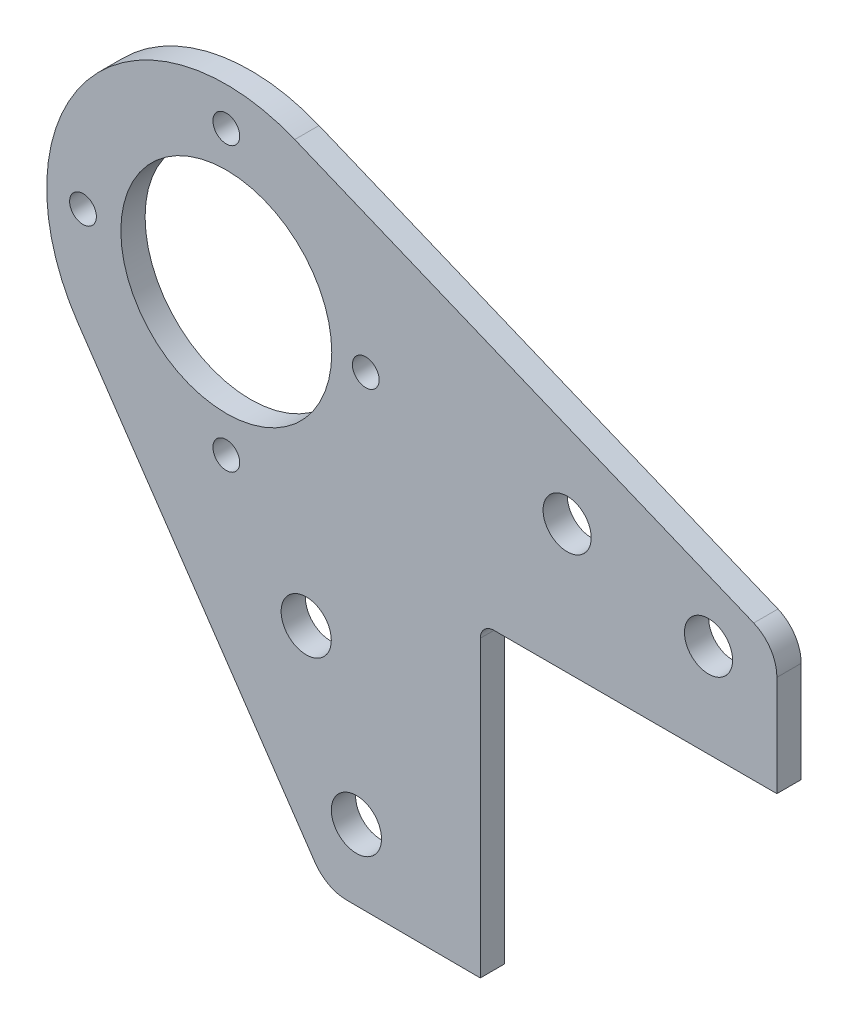
ISO-10303-21;
HEADER;
FILE_DESCRIPTION(('STEP AP214'),'2;1');
FILE_NAME('part.step','',(''),(''),'','','');
FILE_SCHEMA(('AUTOMOTIVE_DESIGN { 1 0 10303 214 1 1 1 1 }'));
ENDSEC;
DATA;
#1=APPLICATION_CONTEXT('core data for automotive mechanical design processes');
#2=APPLICATION_PROTOCOL_DEFINITION('international standard','automotive_design',2000,#1);
#3=PRODUCT_CONTEXT('',#1,'mechanical');
#4=PRODUCT('Part','Part','',(#3));
#5=PRODUCT_RELATED_PRODUCT_CATEGORY('part','',(#4));
#6=PRODUCT_DEFINITION_FORMATION('','',#4);
#7=PRODUCT_DEFINITION_CONTEXT('part definition',#1,'design');
#8=PRODUCT_DEFINITION('design','',#6,#7);
#9=PRODUCT_DEFINITION_SHAPE('','',#8);
#10=(LENGTH_UNIT() NAMED_UNIT(*) SI_UNIT(.MILLI.,.METRE.));
#11=(NAMED_UNIT(*) PLANE_ANGLE_UNIT() SI_UNIT($,.RADIAN.));
#12=(NAMED_UNIT(*) SI_UNIT($,.STERADIAN.) SOLID_ANGLE_UNIT());
#13=UNCERTAINTY_MEASURE_WITH_UNIT(LENGTH_MEASURE(1.E-05),#10,'distance_accuracy_value','');
#14=(GEOMETRIC_REPRESENTATION_CONTEXT(3) GLOBAL_UNCERTAINTY_ASSIGNED_CONTEXT((#13)) GLOBAL_UNIT_ASSIGNED_CONTEXT((#10,
#11,#12)) REPRESENTATION_CONTEXT('',''));
#15=CARTESIAN_POINT('',(0.,0.,0.));
#16=DIRECTION('',(0.,0.,1.));
#17=DIRECTION('',(1.,0.,0.));
#18=AXIS2_PLACEMENT_3D('',#15,#16,#17);
#19=CARTESIAN_POINT('',(38.9957298317535,5.45191666327589,-3.175));
#20=DIRECTION('',(0.,0.,1.));
#21=DIRECTION('',(1.,0.,0.));
#22=AXIS2_PLACEMENT_3D('',#19,#20,#21);
#23=CYLINDRICAL_SURFACE('',#22,4.99999999999999);
#24=CARTESIAN_POINT('',(38.9957298317535,5.45191666327589,0.));
#25=DIRECTION('',(0.,0.,1.));
#26=DIRECTION('',(1.,0.,0.));
#27=AXIS2_PLACEMENT_3D('',#24,#25,#26);
#28=CIRCLE('',#27,4.99999999999999);
#29=CARTESIAN_POINT('',(34.8610962891506,2.64036807426255,0.));
#30=VERTEX_POINT('',#29);
#31=CARTESIAN_POINT('',(38.970667363926,0.451979476399808,0.));
#32=VERTEX_POINT('',#31);
#33=EDGE_CURVE('E152',#30,#32,#28,.T.);
#34=ORIENTED_EDGE('',*,*,#33,.F.);
#35=DIRECTION('',(0.,0.,1.));
#36=VECTOR('',#35,1.);
#37=CARTESIAN_POINT('',(34.8610962891506,2.64036807426255,-3.175));
#38=LINE('',#37,#36);
#39=CARTESIAN_POINT('',(34.8610962891506,2.64036807426255,-3.175));
#40=VERTEX_POINT('',#39);
#41=EDGE_CURVE('E11',#40,#30,#38,.T.);
#42=ORIENTED_EDGE('',*,*,#41,.F.);
#43=CARTESIAN_POINT('',(38.9957298317535,5.45191666327589,-3.175));
#44=DIRECTION('',(0.,0.,1.));
#45=DIRECTION('',(1.,0.,0.));
#46=AXIS2_PLACEMENT_3D('',#43,#44,#45);
#47=CIRCLE('',#46,4.99999999999999);
#48=CARTESIAN_POINT('',(38.970667363926,0.451979476399808,-3.175));
#49=VERTEX_POINT('',#48);
#50=EDGE_CURVE('E179',#40,#49,#47,.T.);
#51=ORIENTED_EDGE('',*,*,#50,.T.);
#52=DIRECTION('',(0.,0.,1.));
#53=VECTOR('',#52,1.);
#54=CARTESIAN_POINT('',(38.970667363926,0.451979476399808,-3.175));
#55=LINE('',#54,#53);
#56=EDGE_CURVE('E46',#49,#32,#55,.T.);
#57=ORIENTED_EDGE('',*,*,#56,.T.);
#58=EDGE_LOOP('',(#34,#42,#51,#57));
#59=FACE_BOUND('',#58,.T.);
#60=ADVANCED_FACE('F43',(#59),#23,.T.);
#61=CARTESIAN_POINT('',(3.8138082519263,48.2981806502894,-3.175));
#62=DIRECTION('',(-0.826926708520586,-0.562309717802662,0.));
#63=DIRECTION('',(0.562309717802662,-0.826926708520586,0.));
#64=AXIS2_PLACEMENT_3D('',#61,#62,#63);
#65=PLANE('',#64);
#66=DIRECTION('',(0.562309717802662,-0.826926708520586,0.));
#67=VECTOR('',#66,1.);
#68=CARTESIAN_POINT('',(3.8138082519263,48.2981806502894,0.));
#69=LINE('',#68,#67);
#70=CARTESIAN_POINT('',(3.8138082519263,48.2981806502894,0.));
#71=VERTEX_POINT('',#70);
#72=EDGE_CURVE('E177',#71,#30,#69,.T.);
#73=ORIENTED_EDGE('',*,*,#72,.F.);
#74=DIRECTION('',(0.,0.,1.));
#75=VECTOR('',#74,1.);
#76=CARTESIAN_POINT('',(3.8138082519263,48.2981806502894,-3.175));
#77=LINE('',#76,#75);
#78=CARTESIAN_POINT('',(3.8138082519263,48.2981806502894,-3.175));
#79=VERTEX_POINT('',#78);
#80=EDGE_CURVE('E52',#79,#71,#77,.T.);
#81=ORIENTED_EDGE('',*,*,#80,.F.);
#82=DIRECTION('',(0.562309717802662,-0.826926708520586,0.));
#83=VECTOR('',#82,1.);
#84=CARTESIAN_POINT('',(3.8138082519263,48.2981806502894,-3.175));
#85=LINE('',#84,#83);
#86=EDGE_CURVE('E142',#79,#40,#85,.T.);
#87=ORIENTED_EDGE('',*,*,#86,.T.);
#88=ORIENTED_EDGE('',*,*,#41,.T.);
#89=EDGE_LOOP('',(#73,#81,#87,#88));
#90=FACE_BOUND('',#89,.T.);
#91=ADVANCED_FACE('F195',(#90),#65,.T.);
#92=CARTESIAN_POINT('',(23.2465826059849,61.5124567772546,-3.175));
#93=DIRECTION('',(0.,0.,1.));
#94=DIRECTION('',(1.,0.,0.));
#95=AXIS2_PLACEMENT_3D('',#92,#93,#94);
#96=CYLINDRICAL_SURFACE('',#95,23.4999960139452);
#97=CARTESIAN_POINT('',(23.2465826059849,61.5124567772546,0.));
#98=DIRECTION('',(0.,0.,1.));
#99=DIRECTION('',(1.,0.,0.));
#100=AXIS2_PLACEMENT_3D('',#97,#98,#99);
#101=CIRCLE('',#100,23.4999960139452);
#102=CARTESIAN_POINT('',(32.2026397845729,83.2389119061821,0.));
#103=VERTEX_POINT('',#102);
#104=EDGE_CURVE('E129',#103,#71,#101,.T.);
#105=ORIENTED_EDGE('',*,*,#104,.F.);
#106=DIRECTION('',(0.,0.,1.));
#107=VECTOR('',#106,1.);
#108=CARTESIAN_POINT('',(32.2026397845729,83.2389119061821,-3.175));
#109=LINE('',#108,#107);
#110=CARTESIAN_POINT('',(32.2026397845729,83.2389119061821,-3.175));
#111=VERTEX_POINT('',#110);
#112=EDGE_CURVE('E124',#111,#103,#109,.T.);
#113=ORIENTED_EDGE('',*,*,#112,.F.);
#114=CARTESIAN_POINT('',(23.2465826059849,61.5124567772546,-3.175));
#115=DIRECTION('',(0.,0.,1.));
#116=DIRECTION('',(1.,0.,0.));
#117=AXIS2_PLACEMENT_3D('',#114,#115,#116);
#118=CIRCLE('',#117,23.4999960139452);
#119=EDGE_CURVE('E127',#111,#79,#118,.T.);
#120=ORIENTED_EDGE('',*,*,#119,.T.);
#121=ORIENTED_EDGE('',*,*,#80,.T.);
#122=EDGE_LOOP('',(#105,#113,#120,#121));
#123=FACE_BOUND('',#122,.T.);
#124=ADVANCED_FACE('F126',(#123),#96,.T.);
#125=CARTESIAN_POINT('',(92.2574763707311,58.4831684070844,-3.175));
#126=DIRECTION('',(0.381108880753566,0.924530162304488,0.));
#127=DIRECTION('',(-0.924530162304489,0.381108880753567,0.));
#128=AXIS2_PLACEMENT_3D('',#125,#126,#127);
#129=PLANE('',#128);
#130=DIRECTION('',(-0.924530162304488,0.381108880753566,0.));
#131=VECTOR('',#130,1.);
#132=CARTESIAN_POINT('',(92.2574763707311,58.4831684070844,0.));
#133=LINE('',#132,#131);
#134=CARTESIAN_POINT('',(92.2574763707311,58.4831684070844,0.));
#135=VERTEX_POINT('',#134);
#136=EDGE_CURVE('E174',#135,#103,#133,.T.);
#137=ORIENTED_EDGE('',*,*,#136,.F.);
#138=DIRECTION('',(0.,0.,1.));
#139=VECTOR('',#138,1.);
#140=CARTESIAN_POINT('',(92.2574763707311,58.4831684070844,-3.175));
#141=LINE('',#140,#139);
#142=CARTESIAN_POINT('',(92.2574763707311,58.4831684070844,-3.175));
#143=VERTEX_POINT('',#142);
#144=EDGE_CURVE('E134',#143,#135,#141,.T.);
#145=ORIENTED_EDGE('',*,*,#144,.F.);
#146=DIRECTION('',(-0.924530162304488,0.381108880753566,0.));
#147=VECTOR('',#146,1.);
#148=CARTESIAN_POINT('',(92.2574763707311,58.4831684070844,-3.175));
#149=LINE('',#148,#147);
#150=EDGE_CURVE('E140',#143,#111,#149,.T.);
#151=ORIENTED_EDGE('',*,*,#150,.T.);
#152=ORIENTED_EDGE('',*,*,#112,.T.);
#153=EDGE_LOOP('',(#137,#145,#151,#152));
#154=FACE_BOUND('',#153,.T.);
#155=ADVANCED_FACE('F144',(#154),#129,.T.);
#156=CARTESIAN_POINT('',(90.2860810938705,53.8882145811605,-3.175));
#157=DIRECTION('',(0.,0.,1.));
#158=DIRECTION('',(1.,0.,0.));
#159=AXIS2_PLACEMENT_3D('',#156,#157,#158);
#160=CYLINDRICAL_SURFACE('',#159,5.00000000000008);
#161=CARTESIAN_POINT('',(90.2860810938705,53.8882145811605,0.));
#162=DIRECTION('',(0.,0.,1.));
#163=DIRECTION('',(1.,0.,0.));
#164=AXIS2_PLACEMENT_3D('',#161,#162,#163);
#165=CIRCLE('',#164,5.00000000000008);
#166=CARTESIAN_POINT('',(95.2858044746185,53.8356207031641,0.));
#167=VERTEX_POINT('',#166);
#168=EDGE_CURVE('E171',#167,#135,#165,.T.);
#169=ORIENTED_EDGE('',*,*,#168,.F.);
#170=DIRECTION('',(0.,0.,1.));
#171=VECTOR('',#170,1.);
#172=CARTESIAN_POINT('',(95.2858044746185,53.8356207031641,-3.175));
#173=LINE('',#172,#171);
#174=CARTESIAN_POINT('',(95.2858044746185,53.8356207031641,-3.175));
#175=VERTEX_POINT('',#174);
#176=EDGE_CURVE('E183',#175,#167,#173,.T.);
#177=ORIENTED_EDGE('',*,*,#176,.F.);
#178=CARTESIAN_POINT('',(90.2860810938705,53.8882145811605,-3.175));
#179=DIRECTION('',(0.,0.,1.));
#180=DIRECTION('',(1.,0.,0.));
#181=AXIS2_PLACEMENT_3D('',#178,#179,#180);
#182=CIRCLE('',#181,5.00000000000008);
#183=EDGE_CURVE('E145',#175,#143,#182,.T.);
#184=ORIENTED_EDGE('',*,*,#183,.T.);
#185=ORIENTED_EDGE('',*,*,#144,.T.);
#186=EDGE_LOOP('',(#169,#177,#184,#185));
#187=FACE_BOUND('',#186,.T.);
#188=ADVANCED_FACE('F208',(#187),#160,.T.);
#189=CARTESIAN_POINT('',(95.2858044746185,40.6556179046592,-3.175));
#190=DIRECTION('',(1.,0.,0.));
#191=DIRECTION('',(0.,0.,-1.));
#192=AXIS2_PLACEMENT_3D('',#189,#190,#191);
#193=PLANE('',#192);
#194=DIRECTION('',(0.,1.,0.));
#195=VECTOR('',#194,1.);
#196=CARTESIAN_POINT('',(95.2858044746185,40.6556179046592,0.));
#197=LINE('',#196,#195);
#198=CARTESIAN_POINT('',(95.2858044746185,40.6556179046592,0.));
#199=VERTEX_POINT('',#198);
#200=EDGE_CURVE('E168',#199,#167,#197,.T.);
#201=ORIENTED_EDGE('',*,*,#200,.F.);
#202=DIRECTION('',(0.,0.,1.));
#203=VECTOR('',#202,1.);
#204=CARTESIAN_POINT('',(95.2858044746185,40.6556179046592,-3.175));
#205=LINE('',#204,#203);
#206=CARTESIAN_POINT('',(95.2858044746185,40.6556179046592,-3.175));
#207=VERTEX_POINT('',#206);
#208=EDGE_CURVE('E185',#207,#199,#205,.T.);
#209=ORIENTED_EDGE('',*,*,#208,.F.);
#210=DIRECTION('',(0.,1.,0.));
#211=VECTOR('',#210,1.);
#212=CARTESIAN_POINT('',(95.2858044746185,40.6556179046592,-3.175));
#213=LINE('',#212,#211);
#214=EDGE_CURVE('E147',#207,#175,#213,.T.);
#215=ORIENTED_EDGE('',*,*,#214,.T.);
#216=ORIENTED_EDGE('',*,*,#176,.T.);
#217=EDGE_LOOP('',(#201,#209,#215,#216));
#218=FACE_BOUND('',#217,.T.);
#219=ADVANCED_FACE('F211',(#218),#193,.T.);
#220=CARTESIAN_POINT('',(58.2853392910616,40.6556179046592,-3.175));
#221=DIRECTION('',(0.,-1.,0.));
#222=DIRECTION('',(0.,0.,-1.));
#223=AXIS2_PLACEMENT_3D('',#220,#221,#222);
#224=PLANE('',#223);
#225=DIRECTION('',(1.,0.,0.));
#226=VECTOR('',#225,1.);
#227=CARTESIAN_POINT('',(58.2853392910616,40.6556179046592,0.));
#228=LINE('',#227,#226);
#229=CARTESIAN_POINT('',(58.2853392910616,40.6556179046592,0.));
#230=VERTEX_POINT('',#229);
#231=EDGE_CURVE('E165',#230,#199,#228,.T.);
#232=ORIENTED_EDGE('',*,*,#231,.F.);
#233=DIRECTION('',(0.,0.,1.));
#234=VECTOR('',#233,1.);
#235=CARTESIAN_POINT('',(58.2853392910616,40.6556179046592,-3.175));
#236=LINE('',#235,#234);
#237=CARTESIAN_POINT('',(58.2853392910616,40.6556179046592,-3.175));
#238=VERTEX_POINT('',#237);
#239=EDGE_CURVE('E187',#238,#230,#236,.T.);
#240=ORIENTED_EDGE('',*,*,#239,.F.);
#241=DIRECTION('',(1.,0.,0.));
#242=VECTOR('',#241,1.);
#243=CARTESIAN_POINT('',(58.2853392910616,40.6556179046592,-3.175));
#244=LINE('',#243,#242);
#245=EDGE_CURVE('E341',#238,#207,#244,.T.);
#246=ORIENTED_EDGE('',*,*,#245,.T.);
#247=ORIENTED_EDGE('',*,*,#208,.T.);
#248=EDGE_LOOP('',(#232,#240,#246,#247));
#249=FACE_BOUND('',#248,.T.);
#250=ADVANCED_FACE('F215',(#249),#224,.T.);
#251=CARTESIAN_POINT('',(58.2763168026436,38.8556405173835,-3.175));
#252=DIRECTION('',(0.,0.,1.));
#253=DIRECTION('',(1.,0.,0.));
#254=AXIS2_PLACEMENT_3D('',#251,#252,#253);
#255=CYLINDRICAL_SURFACE('',#254,1.80000000000027);
#256=CARTESIAN_POINT('',(58.2763168026436,38.8556405173835,0.));
#257=DIRECTION('',(0.,0.,-1.));
#258=DIRECTION('',(1.,0.,0.));
#259=AXIS2_PLACEMENT_3D('',#256,#257,#258);
#260=CIRCLE('',#259,1.80000000000027);
#261=CARTESIAN_POINT('',(56.476339415368,38.8646630058014,0.));
#262=VERTEX_POINT('',#261);
#263=EDGE_CURVE('E162',#262,#230,#260,.T.);
#264=ORIENTED_EDGE('',*,*,#263,.F.);
#265=DIRECTION('',(0.,0.,1.));
#266=VECTOR('',#265,1.);
#267=CARTESIAN_POINT('',(56.476339415368,38.8646630058014,-3.175));
#268=LINE('',#267,#266);
#269=CARTESIAN_POINT('',(56.476339415368,38.8646630058014,-3.175));
#270=VERTEX_POINT('',#269);
#271=EDGE_CURVE('E189',#270,#262,#268,.T.);
#272=ORIENTED_EDGE('',*,*,#271,.F.);
#273=CARTESIAN_POINT('',(58.2763168026436,38.8556405173835,-3.175));
#274=DIRECTION('',(0.,0.,-1.));
#275=DIRECTION('',(1.,0.,0.));
#276=AXIS2_PLACEMENT_3D('',#273,#274,#275);
#277=CIRCLE('',#276,1.80000000000027);
#278=EDGE_CURVE('E338',#270,#238,#277,.T.);
#279=ORIENTED_EDGE('',*,*,#278,.T.);
#280=ORIENTED_EDGE('',*,*,#239,.T.);
#281=EDGE_LOOP('',(#264,#272,#279,#280));
#282=FACE_BOUND('',#281,.T.);
#283=ADVANCED_FACE('F219',(#282),#255,.F.);
#284=CARTESIAN_POINT('',(56.476339415368,0.364231305534529,-3.175));
#285=DIRECTION('',(1.,0.,0.));
#286=DIRECTION('',(0.,0.,-1.));
#287=AXIS2_PLACEMENT_3D('',#284,#285,#286);
#288=PLANE('',#287);
#289=DIRECTION('',(0.,1.,0.));
#290=VECTOR('',#289,1.);
#291=CARTESIAN_POINT('',(56.476339415368,0.364231305534529,0.));
#292=LINE('',#291,#290);
#293=CARTESIAN_POINT('',(56.476339415368,0.364231305534529,0.));
#294=VERTEX_POINT('',#293);
#295=EDGE_CURVE('E159',#294,#262,#292,.T.);
#296=ORIENTED_EDGE('',*,*,#295,.F.);
#297=DIRECTION('',(0.,0.,1.));
#298=VECTOR('',#297,1.);
#299=CARTESIAN_POINT('',(56.476339415368,0.364231305534529,-3.175));
#300=LINE('',#299,#298);
#301=CARTESIAN_POINT('',(56.476339415368,0.364231305534529,-3.175));
#302=VERTEX_POINT('',#301);
#303=EDGE_CURVE('E190',#302,#294,#300,.T.);
#304=ORIENTED_EDGE('',*,*,#303,.F.);
#305=DIRECTION('',(0.,1.,0.));
#306=VECTOR('',#305,1.);
#307=CARTESIAN_POINT('',(56.476339415368,0.364231305534529,-3.175));
#308=LINE('',#307,#306);
#309=EDGE_CURVE('E335',#302,#270,#308,.T.);
#310=ORIENTED_EDGE('',*,*,#309,.T.);
#311=ORIENTED_EDGE('',*,*,#271,.T.);
#312=EDGE_LOOP('',(#296,#304,#310,#311));
#313=FACE_BOUND('',#312,.T.);
#314=ADVANCED_FACE('F223',(#313),#288,.T.);
#315=CARTESIAN_POINT('',(38.970667363926,0.451979476399808,-3.175));
#316=DIRECTION('',(-0.00501249356551869,-0.999987437375218,0.));
#317=DIRECTION('',(0.999987437375218,-0.00501249356551869,0.));
#318=AXIS2_PLACEMENT_3D('',#315,#316,#317);
#319=PLANE('',#318);
#320=DIRECTION('',(0.999987437375218,-0.00501249356551869,0.));
#321=VECTOR('',#320,1.);
#322=CARTESIAN_POINT('',(38.970667363926,0.451979476399808,0.));
#323=LINE('',#322,#321);
#324=EDGE_CURVE('E155',#32,#294,#323,.T.);
#325=ORIENTED_EDGE('',*,*,#324,.F.);
#326=ORIENTED_EDGE('',*,*,#56,.F.);
#327=DIRECTION('',(0.999987437375218,-0.00501249356551869,0.));
#328=VECTOR('',#327,1.);
#329=CARTESIAN_POINT('',(38.970667363926,0.451979476399808,-3.175));
#330=LINE('',#329,#328);
#331=EDGE_CURVE('E333',#49,#302,#330,.T.);
#332=ORIENTED_EDGE('',*,*,#331,.T.);
#333=ORIENTED_EDGE('',*,*,#303,.T.);
#334=EDGE_LOOP('',(#325,#326,#332,#333));
#335=FACE_BOUND('',#334,.T.);
#336=ADVANCED_FACE('F192',(#335),#319,.T.);
#337=CARTESIAN_POINT('',(38.9957298317535,5.45191666327589,-3.175));
#338=DIRECTION('',(0.,0.,1.));
#339=DIRECTION('',(1.,0.,0.));
#340=AXIS2_PLACEMENT_3D('',#337,#338,#339);
#341=PLANE('',#340);
#342=CARTESIAN_POINT('',(86.3417862445678,52.8877254532409,-3.175));
#343=DIRECTION('',(0.,0.,1.));
#344=DIRECTION('',(1.,0.,0.));
#345=AXIS2_PLACEMENT_3D('',#342,#343,#344);
#346=CIRCLE('',#345,3.15000000000012);
#347=CARTESIAN_POINT('',(89.491786244568,52.8877254532409,-3.175));
#348=VERTEX_POINT('',#347);
#349=EDGE_CURVE('E278',#348,#348,#346,.T.);
#350=ORIENTED_EDGE('',*,*,#349,.T.);
#351=EDGE_LOOP('',(#350));
#352=FACE_BOUND('',#351,.T.);
#353=CARTESIAN_POINT('',(40.2697971329921,9.66787789915378,-3.175));
#354=DIRECTION('',(0.,0.,1.));
#355=DIRECTION('',(1.,0.,0.));
#356=AXIS2_PLACEMENT_3D('',#353,#354,#355);
#357=CIRCLE('',#356,3.28245761780858);
#358=CARTESIAN_POINT('',(43.5522547508007,9.66787789915378,-3.175));
#359=VERTEX_POINT('',#358);
#360=EDGE_CURVE('E287',#359,#359,#357,.T.);
#361=ORIENTED_EDGE('',*,*,#360,.T.);
#362=EDGE_LOOP('',(#361));
#363=FACE_BOUND('',#362,.T.);
#364=CARTESIAN_POINT('',(33.7011723494366,28.8843163818606,-3.175));
#365=DIRECTION('',(0.,0.,1.));
#366=DIRECTION('',(1.,0.,0.));
#367=AXIS2_PLACEMENT_3D('',#364,#365,#366);
#368=CIRCLE('',#367,3.28245761780859);
#369=CARTESIAN_POINT('',(36.9836299672451,28.8843163818606,-3.175));
#370=VERTEX_POINT('',#369);
#371=EDGE_CURVE('E295',#370,#370,#368,.T.);
#372=ORIENTED_EDGE('',*,*,#371,.T.);
#373=EDGE_LOOP('',(#372));
#374=FACE_BOUND('',#373,.T.);
#375=CARTESIAN_POINT('',(67.8436679475657,57.5027499943583,-3.175));
#376=DIRECTION('',(0.,0.,1.));
#377=DIRECTION('',(1.,0.,0.));
#378=AXIS2_PLACEMENT_3D('',#375,#376,#377);
#379=CIRCLE('',#378,3.15000000000012);
#380=CARTESIAN_POINT('',(70.9936679475659,57.5027499943583,-3.175));
#381=VERTEX_POINT('',#380);
#382=EDGE_CURVE('E301',#381,#381,#379,.T.);
#383=ORIENTED_EDGE('',*,*,#382,.T.);
#384=EDGE_LOOP('',(#383));
#385=FACE_BOUND('',#384,.T.);
#386=CARTESIAN_POINT('',(23.2465826059849,61.5124567772546,-3.175));
#387=DIRECTION('',(0.,0.,1.));
#388=DIRECTION('',(1.,0.,0.));
#389=AXIS2_PLACEMENT_3D('',#386,#387,#388);
#390=CIRCLE('',#389,13.8000000000001);
#391=CARTESIAN_POINT('',(37.046582605985,61.5124567772546,-3.175));
#392=VERTEX_POINT('',#391);
#393=EDGE_CURVE('E304',#392,#392,#390,.T.);
#394=ORIENTED_EDGE('',*,*,#393,.T.);
#395=EDGE_LOOP('',(#394));
#396=FACE_BOUND('',#395,.T.);
#397=CARTESIAN_POINT('',(41.4929347605286,61.5124567772546,-3.175));
#398=DIRECTION('',(0.,0.,1.));
#399=DIRECTION('',(1.,0.,0.));
#400=AXIS2_PLACEMENT_3D('',#397,#398,#399);
#401=CIRCLE('',#400,1.75000000000007);
#402=CARTESIAN_POINT('',(43.2429347605287,61.5124567772546,-3.175));
#403=VERTEX_POINT('',#402);
#404=EDGE_CURVE('E310',#403,#403,#401,.T.);
#405=ORIENTED_EDGE('',*,*,#404,.T.);
#406=EDGE_LOOP('',(#405));
#407=FACE_BOUND('',#406,.T.);
#408=CARTESIAN_POINT('',(23.2465826059849,80.0122243686959,-3.175));
#409=DIRECTION('',(0.,0.,1.));
#410=DIRECTION('',(1.,0.,0.));
#411=AXIS2_PLACEMENT_3D('',#408,#409,#410);
#412=CIRCLE('',#411,1.75000000000034);
#413=CARTESIAN_POINT('',(24.9965826059852,80.0122243686959,-3.175));
#414=VERTEX_POINT('',#413);
#415=EDGE_CURVE('E316',#414,#414,#412,.T.);
#416=ORIENTED_EDGE('',*,*,#415,.T.);
#417=EDGE_LOOP('',(#416));
#418=FACE_BOUND('',#417,.T.);
#419=CARTESIAN_POINT('',(4.4933995776455,61.5124567772546,-3.175));
#420=DIRECTION('',(0.,0.,1.));
#421=DIRECTION('',(1.,0.,0.));
#422=AXIS2_PLACEMENT_3D('',#419,#420,#421);
#423=CIRCLE('',#422,1.75000000000007);
#424=CARTESIAN_POINT('',(6.24339957764557,61.5124567772546,-3.175));
#425=VERTEX_POINT('',#424);
#426=EDGE_CURVE('E322',#425,#425,#423,.T.);
#427=ORIENTED_EDGE('',*,*,#426,.T.);
#428=EDGE_LOOP('',(#427));
#429=FACE_BOUND('',#428,.T.);
#430=CARTESIAN_POINT('',(23.2465826059849,43.0126891858132,-3.175));
#431=DIRECTION('',(0.,0.,1.));
#432=DIRECTION('',(1.,0.,0.));
#433=AXIS2_PLACEMENT_3D('',#430,#431,#432);
#434=CIRCLE('',#433,1.75000000000008);
#435=CARTESIAN_POINT('',(24.996582605985,43.0126891858132,-3.175));
#436=VERTEX_POINT('',#435);
#437=EDGE_CURVE('E156',#436,#436,#434,.T.);
#438=ORIENTED_EDGE('',*,*,#437,.T.);
#439=EDGE_LOOP('',(#438));
#440=FACE_BOUND('',#439,.T.);
#441=ORIENTED_EDGE('',*,*,#50,.F.);
#442=ORIENTED_EDGE('',*,*,#86,.F.);
#443=ORIENTED_EDGE('',*,*,#119,.F.);
#444=ORIENTED_EDGE('',*,*,#150,.F.);
#445=ORIENTED_EDGE('',*,*,#183,.F.);
#446=ORIENTED_EDGE('',*,*,#214,.F.);
#447=ORIENTED_EDGE('',*,*,#245,.F.);
#448=ORIENTED_EDGE('',*,*,#278,.F.);
#449=ORIENTED_EDGE('',*,*,#309,.F.);
#450=ORIENTED_EDGE('',*,*,#331,.F.);
#451=EDGE_LOOP('',(#441,#442,#443,#444,#445,#446,#447,#448,#449,#450));
#452=FACE_BOUND('',#451,.T.);
#453=ADVANCED_FACE('F138',(#352,#363,#374,#385,#396,#407,#418,#429,#440,#452),#341,.F.);
#454=CARTESIAN_POINT('',(38.9957298317535,5.45191666327589,0.));
#455=DIRECTION('',(0.,0.,1.));
#456=DIRECTION('',(1.,0.,0.));
#457=AXIS2_PLACEMENT_3D('',#454,#455,#456);
#458=PLANE('',#457);
#459=CARTESIAN_POINT('',(86.3417862445678,52.8877254532409,0.));
#460=DIRECTION('',(0.,0.,1.));
#461=DIRECTION('',(1.,0.,0.));
#462=AXIS2_PLACEMENT_3D('',#459,#460,#461);
#463=CIRCLE('',#462,3.15000000000012);
#464=CARTESIAN_POINT('',(89.491786244568,52.8877254532409,0.));
#465=VERTEX_POINT('',#464);
#466=EDGE_CURVE('E281',#465,#465,#463,.T.);
#467=ORIENTED_EDGE('',*,*,#466,.F.);
#468=EDGE_LOOP('',(#467));
#469=FACE_BOUND('',#468,.T.);
#470=CARTESIAN_POINT('',(40.2697971329921,9.66787789915378,0.));
#471=DIRECTION('',(0.,0.,1.));
#472=DIRECTION('',(1.,0.,0.));
#473=AXIS2_PLACEMENT_3D('',#470,#471,#472);
#474=CIRCLE('',#473,3.28245761780858);
#475=CARTESIAN_POINT('',(43.5522547508007,9.66787789915378,0.));
#476=VERTEX_POINT('',#475);
#477=EDGE_CURVE('E282',#476,#476,#474,.T.);
#478=ORIENTED_EDGE('',*,*,#477,.F.);
#479=EDGE_LOOP('',(#478));
#480=FACE_BOUND('',#479,.T.);
#481=CARTESIAN_POINT('',(33.7011723494366,28.8843163818606,0.));
#482=DIRECTION('',(0.,0.,1.));
#483=DIRECTION('',(1.,0.,0.));
#484=AXIS2_PLACEMENT_3D('',#481,#482,#483);
#485=CIRCLE('',#484,3.28245761780859);
#486=CARTESIAN_POINT('',(36.9836299672451,28.8843163818606,0.));
#487=VERTEX_POINT('',#486);
#488=EDGE_CURVE('E292',#487,#487,#485,.T.);
#489=ORIENTED_EDGE('',*,*,#488,.F.);
#490=EDGE_LOOP('',(#489));
#491=FACE_BOUND('',#490,.T.);
#492=CARTESIAN_POINT('',(67.8436679475657,57.5027499943583,0.));
#493=DIRECTION('',(0.,0.,1.));
#494=DIRECTION('',(1.,0.,0.));
#495=AXIS2_PLACEMENT_3D('',#492,#493,#494);
#496=CIRCLE('',#495,3.15000000000012);
#497=CARTESIAN_POINT('',(70.9936679475659,57.5027499943583,0.));
#498=VERTEX_POINT('',#497);
#499=EDGE_CURVE('E298',#498,#498,#496,.T.);
#500=ORIENTED_EDGE('',*,*,#499,.F.);
#501=EDGE_LOOP('',(#500));
#502=FACE_BOUND('',#501,.T.);
#503=CARTESIAN_POINT('',(23.2465826059849,61.5124567772546,0.));
#504=DIRECTION('',(0.,0.,1.));
#505=DIRECTION('',(1.,0.,0.));
#506=AXIS2_PLACEMENT_3D('',#503,#504,#505);
#507=CIRCLE('',#506,13.8000000000001);
#508=CARTESIAN_POINT('',(37.046582605985,61.5124567772546,0.));
#509=VERTEX_POINT('',#508);
#510=EDGE_CURVE('E284',#509,#509,#507,.T.);
#511=ORIENTED_EDGE('',*,*,#510,.F.);
#512=EDGE_LOOP('',(#511));
#513=FACE_BOUND('',#512,.T.);
#514=CARTESIAN_POINT('',(41.4929347605286,61.5124567772546,0.));
#515=DIRECTION('',(0.,0.,1.));
#516=DIRECTION('',(1.,0.,0.));
#517=AXIS2_PLACEMENT_3D('',#514,#515,#516);
#518=CIRCLE('',#517,1.75000000000007);
#519=CARTESIAN_POINT('',(43.2429347605287,61.5124567772546,0.));
#520=VERTEX_POINT('',#519);
#521=EDGE_CURVE('E307',#520,#520,#518,.T.);
#522=ORIENTED_EDGE('',*,*,#521,.F.);
#523=EDGE_LOOP('',(#522));
#524=FACE_BOUND('',#523,.T.);
#525=CARTESIAN_POINT('',(23.2465826059849,80.0122243686959,0.));
#526=DIRECTION('',(0.,0.,1.));
#527=DIRECTION('',(1.,0.,0.));
#528=AXIS2_PLACEMENT_3D('',#525,#526,#527);
#529=CIRCLE('',#528,1.75000000000034);
#530=CARTESIAN_POINT('',(24.9965826059852,80.0122243686959,0.));
#531=VERTEX_POINT('',#530);
#532=EDGE_CURVE('E313',#531,#531,#529,.T.);
#533=ORIENTED_EDGE('',*,*,#532,.F.);
#534=EDGE_LOOP('',(#533));
#535=FACE_BOUND('',#534,.T.);
#536=CARTESIAN_POINT('',(4.4933995776455,61.5124567772546,0.));
#537=DIRECTION('',(0.,0.,1.));
#538=DIRECTION('',(1.,0.,0.));
#539=AXIS2_PLACEMENT_3D('',#536,#537,#538);
#540=CIRCLE('',#539,1.75000000000007);
#541=CARTESIAN_POINT('',(6.24339957764557,61.5124567772546,0.));
#542=VERTEX_POINT('',#541);
#543=EDGE_CURVE('E319',#542,#542,#540,.T.);
#544=ORIENTED_EDGE('',*,*,#543,.F.);
#545=EDGE_LOOP('',(#544));
#546=FACE_BOUND('',#545,.T.);
#547=CARTESIAN_POINT('',(23.2465826059849,43.0126891858132,0.));
#548=DIRECTION('',(0.,0.,1.));
#549=DIRECTION('',(1.,0.,0.));
#550=AXIS2_PLACEMENT_3D('',#547,#548,#549);
#551=CIRCLE('',#550,1.75000000000008);
#552=CARTESIAN_POINT('',(24.996582605985,43.0126891858132,0.));
#553=VERTEX_POINT('',#552);
#554=EDGE_CURVE('E325',#553,#553,#551,.T.);
#555=ORIENTED_EDGE('',*,*,#554,.F.);
#556=EDGE_LOOP('',(#555));
#557=FACE_BOUND('',#556,.T.);
#558=ORIENTED_EDGE('',*,*,#33,.T.);
#559=ORIENTED_EDGE('',*,*,#324,.T.);
#560=ORIENTED_EDGE('',*,*,#295,.T.);
#561=ORIENTED_EDGE('',*,*,#263,.T.);
#562=ORIENTED_EDGE('',*,*,#231,.T.);
#563=ORIENTED_EDGE('',*,*,#200,.T.);
#564=ORIENTED_EDGE('',*,*,#168,.T.);
#565=ORIENTED_EDGE('',*,*,#136,.T.);
#566=ORIENTED_EDGE('',*,*,#104,.T.);
#567=ORIENTED_EDGE('',*,*,#72,.T.);
#568=EDGE_LOOP('',(#558,#559,#560,#561,#562,#563,#564,#565,#566,#567));
#569=FACE_BOUND('',#568,.T.);
#570=ADVANCED_FACE('F194',(#469,#480,#491,#502,#513,#524,#535,#546,#557,#569),#458,.T.);
#571=CARTESIAN_POINT('',(23.2465826059849,43.0126891858132,-3.175));
#572=DIRECTION('',(0.,0.,1.));
#573=DIRECTION('',(1.,0.,0.));
#574=AXIS2_PLACEMENT_3D('',#571,#572,#573);
#575=CYLINDRICAL_SURFACE('',#574,1.75000000000008);
#576=ORIENTED_EDGE('',*,*,#437,.F.);
#577=EDGE_LOOP('',(#576));
#578=FACE_BOUND('',#577,.T.);
#579=ORIENTED_EDGE('',*,*,#554,.T.);
#580=EDGE_LOOP('',(#579));
#581=FACE_BOUND('',#580,.T.);
#582=ADVANCED_FACE('F237',(#578,#581),#575,.F.);
#583=CARTESIAN_POINT('',(4.4933995776455,61.5124567772546,-3.175));
#584=DIRECTION('',(0.,0.,1.));
#585=DIRECTION('',(1.,0.,0.));
#586=AXIS2_PLACEMENT_3D('',#583,#584,#585);
#587=CYLINDRICAL_SURFACE('',#586,1.75000000000007);
#588=ORIENTED_EDGE('',*,*,#426,.F.);
#589=EDGE_LOOP('',(#588));
#590=FACE_BOUND('',#589,.T.);
#591=ORIENTED_EDGE('',*,*,#543,.T.);
#592=EDGE_LOOP('',(#591));
#593=FACE_BOUND('',#592,.T.);
#594=ADVANCED_FACE('F243',(#590,#593),#587,.F.);
#595=CARTESIAN_POINT('',(23.2465826059849,80.0122243686959,-3.175));
#596=DIRECTION('',(0.,0.,1.));
#597=DIRECTION('',(1.,0.,0.));
#598=AXIS2_PLACEMENT_3D('',#595,#596,#597);
#599=CYLINDRICAL_SURFACE('',#598,1.75000000000034);
#600=ORIENTED_EDGE('',*,*,#415,.F.);
#601=EDGE_LOOP('',(#600));
#602=FACE_BOUND('',#601,.T.);
#603=ORIENTED_EDGE('',*,*,#532,.T.);
#604=EDGE_LOOP('',(#603));
#605=FACE_BOUND('',#604,.T.);
#606=ADVANCED_FACE('F247',(#602,#605),#599,.F.);
#607=CARTESIAN_POINT('',(41.4929347605286,61.5124567772546,-3.175));
#608=DIRECTION('',(0.,0.,1.));
#609=DIRECTION('',(1.,0.,0.));
#610=AXIS2_PLACEMENT_3D('',#607,#608,#609);
#611=CYLINDRICAL_SURFACE('',#610,1.75000000000007);
#612=ORIENTED_EDGE('',*,*,#404,.F.);
#613=EDGE_LOOP('',(#612));
#614=FACE_BOUND('',#613,.T.);
#615=ORIENTED_EDGE('',*,*,#521,.T.);
#616=EDGE_LOOP('',(#615));
#617=FACE_BOUND('',#616,.T.);
#618=ADVANCED_FACE('F251',(#614,#617),#611,.F.);
#619=CARTESIAN_POINT('',(23.2465826059849,61.5124567772546,-3.175));
#620=DIRECTION('',(0.,0.,1.));
#621=DIRECTION('',(1.,0.,0.));
#622=AXIS2_PLACEMENT_3D('',#619,#620,#621);
#623=CYLINDRICAL_SURFACE('',#622,13.8000000000001);
#624=ORIENTED_EDGE('',*,*,#393,.F.);
#625=EDGE_LOOP('',(#624));
#626=FACE_BOUND('',#625,.T.);
#627=ORIENTED_EDGE('',*,*,#510,.T.);
#628=EDGE_LOOP('',(#627));
#629=FACE_BOUND('',#628,.T.);
#630=ADVANCED_FACE('F255',(#626,#629),#623,.F.);
#631=CARTESIAN_POINT('',(67.8436679475657,57.5027499943583,-3.175));
#632=DIRECTION('',(0.,0.,1.));
#633=DIRECTION('',(1.,0.,0.));
#634=AXIS2_PLACEMENT_3D('',#631,#632,#633);
#635=CYLINDRICAL_SURFACE('',#634,3.15000000000012);
#636=ORIENTED_EDGE('',*,*,#382,.F.);
#637=EDGE_LOOP('',(#636));
#638=FACE_BOUND('',#637,.T.);
#639=ORIENTED_EDGE('',*,*,#499,.T.);
#640=EDGE_LOOP('',(#639));
#641=FACE_BOUND('',#640,.T.);
#642=ADVANCED_FACE('F258',(#638,#641),#635,.F.);
#643=CARTESIAN_POINT('',(33.7011723494366,28.8843163818606,-3.175));
#644=DIRECTION('',(0.,0.,1.));
#645=DIRECTION('',(1.,0.,0.));
#646=AXIS2_PLACEMENT_3D('',#643,#644,#645);
#647=CYLINDRICAL_SURFACE('',#646,3.28245761780859);
#648=ORIENTED_EDGE('',*,*,#371,.F.);
#649=EDGE_LOOP('',(#648));
#650=FACE_BOUND('',#649,.T.);
#651=ORIENTED_EDGE('',*,*,#488,.T.);
#652=EDGE_LOOP('',(#651));
#653=FACE_BOUND('',#652,.T.);
#654=ADVANCED_FACE('F262',(#650,#653),#647,.F.);
#655=CARTESIAN_POINT('',(40.2697971329921,9.66787789915378,-3.175));
#656=DIRECTION('',(0.,0.,1.));
#657=DIRECTION('',(1.,0.,0.));
#658=AXIS2_PLACEMENT_3D('',#655,#656,#657);
#659=CYLINDRICAL_SURFACE('',#658,3.28245761780858);
#660=ORIENTED_EDGE('',*,*,#360,.F.);
#661=EDGE_LOOP('',(#660));
#662=FACE_BOUND('',#661,.T.);
#663=ORIENTED_EDGE('',*,*,#477,.T.);
#664=EDGE_LOOP('',(#663));
#665=FACE_BOUND('',#664,.T.);
#666=ADVANCED_FACE('F266',(#662,#665),#659,.F.);
#667=CARTESIAN_POINT('',(86.3417862445678,52.8877254532409,-3.175));
#668=DIRECTION('',(0.,0.,1.));
#669=DIRECTION('',(1.,0.,0.));
#670=AXIS2_PLACEMENT_3D('',#667,#668,#669);
#671=CYLINDRICAL_SURFACE('',#670,3.15000000000012);
#672=ORIENTED_EDGE('',*,*,#349,.F.);
#673=EDGE_LOOP('',(#672));
#674=FACE_BOUND('',#673,.T.);
#675=ORIENTED_EDGE('',*,*,#466,.T.);
#676=EDGE_LOOP('',(#675));
#677=FACE_BOUND('',#676,.T.);
#678=ADVANCED_FACE('F270',(#674,#677),#671,.F.);
#679=CLOSED_SHELL('',(#60,#91,#124,#155,#188,#219,#250,#283,#314,#336,#453,#570,#582,#594,#606,
#618,#630,#642,#654,#666,#678));
#680=MANIFOLD_SOLID_BREP('B2',#679);
#681=ADVANCED_BREP_SHAPE_REPRESENTATION('',(#18,#680),#14);
#682=SHAPE_DEFINITION_REPRESENTATION(#9,#681);
ENDSEC;
END-ISO-10303-21;
